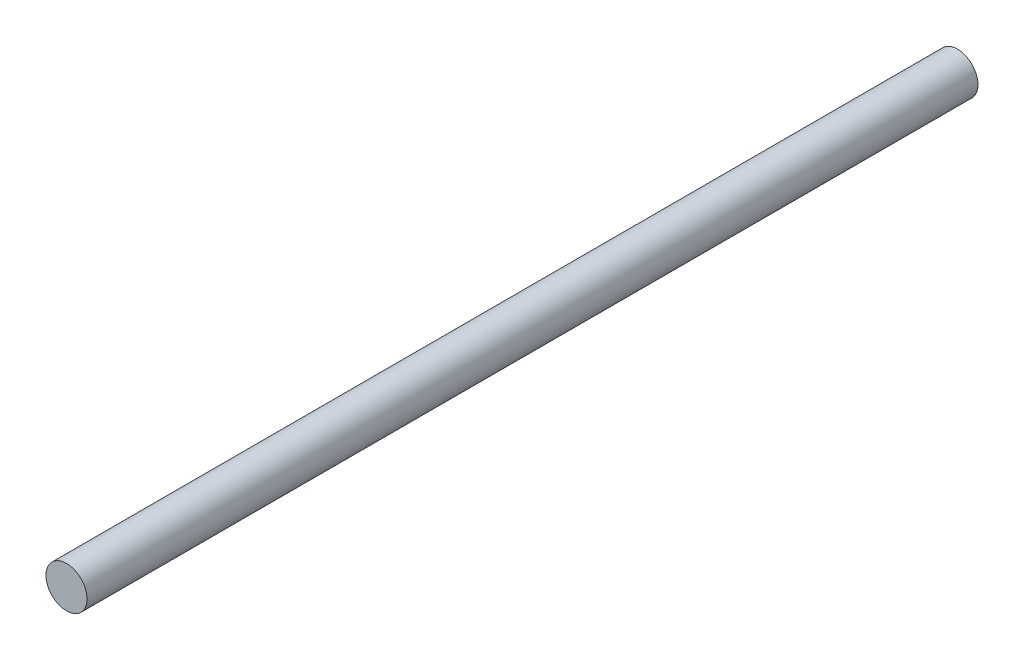
ISO-10303-21;
HEADER;
FILE_DESCRIPTION(('STEP AP214'),'2;1');
FILE_NAME('part.step','',(''),(''),'','','');
FILE_SCHEMA(('AUTOMOTIVE_DESIGN { 1 0 10303 214 1 1 1 1 }'));
ENDSEC;
DATA;
#1=APPLICATION_CONTEXT('core data for automotive mechanical design processes');
#2=APPLICATION_PROTOCOL_DEFINITION('international standard','automotive_design',2000,#1);
#3=PRODUCT_CONTEXT('',#1,'mechanical');
#4=PRODUCT('Part','Part','',(#3));
#5=PRODUCT_RELATED_PRODUCT_CATEGORY('part','',(#4));
#6=PRODUCT_DEFINITION_FORMATION('','',#4);
#7=PRODUCT_DEFINITION_CONTEXT('part definition',#1,'design');
#8=PRODUCT_DEFINITION('design','',#6,#7);
#9=PRODUCT_DEFINITION_SHAPE('','',#8);
#10=(LENGTH_UNIT() NAMED_UNIT(*) SI_UNIT(.MILLI.,.METRE.));
#11=(NAMED_UNIT(*) PLANE_ANGLE_UNIT() SI_UNIT($,.RADIAN.));
#12=(NAMED_UNIT(*) SI_UNIT($,.STERADIAN.) SOLID_ANGLE_UNIT());
#13=UNCERTAINTY_MEASURE_WITH_UNIT(LENGTH_MEASURE(1.E-05),#10,'distance_accuracy_value','');
#14=(GEOMETRIC_REPRESENTATION_CONTEXT(3) GLOBAL_UNCERTAINTY_ASSIGNED_CONTEXT((#13)) GLOBAL_UNIT_ASSIGNED_CONTEXT((#10,
#11,#12)) REPRESENTATION_CONTEXT('',''));
#15=CARTESIAN_POINT('',(0.,0.,0.));
#16=DIRECTION('',(0.,0.,1.));
#17=DIRECTION('',(1.,0.,0.));
#18=AXIS2_PLACEMENT_3D('',#15,#16,#17);
#19=CARTESIAN_POINT('',(0.,0.,65.));
#20=DIRECTION('',(0.,0.,-1.));
#21=DIRECTION('',(-1.,0.,0.));
#22=AXIS2_PLACEMENT_3D('',#19,#20,#21);
#23=CYLINDRICAL_SURFACE('',#22,1.5);
#24=CARTESIAN_POINT('',(0.,0.,65.));
#25=DIRECTION('',(0.,0.,1.));
#26=DIRECTION('',(1.,0.,0.));
#27=AXIS2_PLACEMENT_3D('',#24,#25,#26);
#28=CIRCLE('',#27,1.5);
#29=CARTESIAN_POINT('',(1.5,0.,65.));
#30=VERTEX_POINT('',#29);
#31=EDGE_CURVE('E10',#30,#30,#28,.T.);
#32=ORIENTED_EDGE('',*,*,#31,.F.);
#33=EDGE_LOOP('',(#32));
#34=FACE_BOUND('',#33,.T.);
#35=CARTESIAN_POINT('',(0.,0.,0.));
#36=DIRECTION('',(0.,0.,1.));
#37=DIRECTION('',(1.,0.,0.));
#38=AXIS2_PLACEMENT_3D('',#35,#36,#37);
#39=CIRCLE('',#38,1.5);
#40=CARTESIAN_POINT('',(1.5,0.,0.));
#41=VERTEX_POINT('',#40);
#42=EDGE_CURVE('E40',#41,#41,#39,.T.);
#43=ORIENTED_EDGE('',*,*,#42,.T.);
#44=EDGE_LOOP('',(#43));
#45=FACE_BOUND('',#44,.T.);
#46=ADVANCED_FACE('F37',(#34,#45),#23,.T.);
#47=CARTESIAN_POINT('',(0.,0.,65.));
#48=DIRECTION('',(0.,0.,1.));
#49=DIRECTION('',(1.,0.,0.));
#50=AXIS2_PLACEMENT_3D('',#47,#48,#49);
#51=PLANE('',#50);
#52=ORIENTED_EDGE('',*,*,#31,.T.);
#53=EDGE_LOOP('',(#52));
#54=FACE_BOUND('',#53,.T.);
#55=ADVANCED_FACE('F52',(#54),#51,.T.);
#56=CARTESIAN_POINT('',(0.,0.,0.));
#57=DIRECTION('',(0.,0.,1.));
#58=DIRECTION('',(1.,0.,0.));
#59=AXIS2_PLACEMENT_3D('',#56,#57,#58);
#60=PLANE('',#59);
#61=ORIENTED_EDGE('',*,*,#42,.F.);
#62=EDGE_LOOP('',(#61));
#63=FACE_BOUND('',#62,.T.);
#64=ADVANCED_FACE('F50',(#63),#60,.F.);
#65=CLOSED_SHELL('',(#46,#55,#64));
#66=MANIFOLD_SOLID_BREP('B2',#65);
#67=ADVANCED_BREP_SHAPE_REPRESENTATION('',(#18,#66),#14);
#68=SHAPE_DEFINITION_REPRESENTATION(#9,#67);
ENDSEC;
END-ISO-10303-21;
